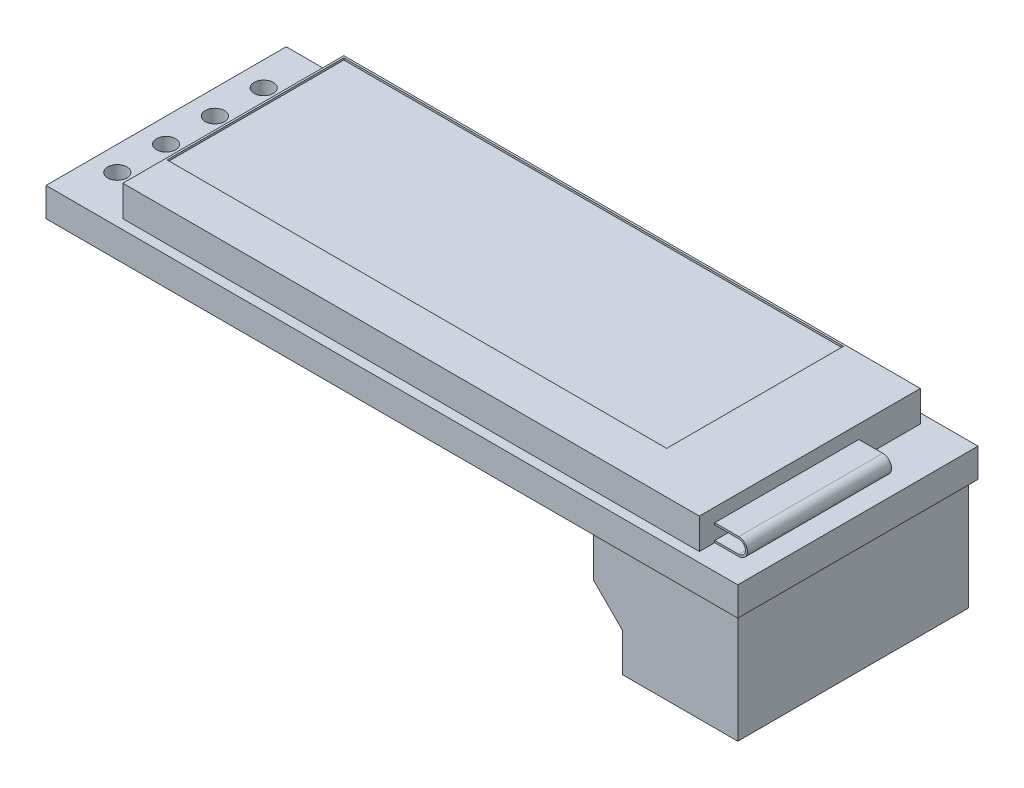
ISO-10303-21;
HEADER;
FILE_DESCRIPTION(('STEP AP214'),'2;1');
FILE_NAME('part.step','',(''),(''),'','','');
FILE_SCHEMA(('AUTOMOTIVE_DESIGN { 1 0 10303 214 1 1 1 1 }'));
ENDSEC;
DATA;
#1=APPLICATION_CONTEXT('core data for automotive mechanical design processes');
#2=APPLICATION_PROTOCOL_DEFINITION('international standard','automotive_design',2000,#1);
#3=PRODUCT_CONTEXT('',#1,'mechanical');
#4=PRODUCT('Part','Part','',(#3));
#5=PRODUCT_RELATED_PRODUCT_CATEGORY('part','',(#4));
#6=PRODUCT_DEFINITION_FORMATION('','',#4);
#7=PRODUCT_DEFINITION_CONTEXT('part definition',#1,'design');
#8=PRODUCT_DEFINITION('design','',#6,#7);
#9=PRODUCT_DEFINITION_SHAPE('','',#8);
#10=(LENGTH_UNIT() NAMED_UNIT(*) SI_UNIT(.MILLI.,.METRE.));
#11=(NAMED_UNIT(*) PLANE_ANGLE_UNIT() SI_UNIT($,.RADIAN.));
#12=(NAMED_UNIT(*) SI_UNIT($,.STERADIAN.) SOLID_ANGLE_UNIT());
#13=UNCERTAINTY_MEASURE_WITH_UNIT(LENGTH_MEASURE(1.E-05),#10,'distance_accuracy_value','');
#14=(GEOMETRIC_REPRESENTATION_CONTEXT(3) GLOBAL_UNCERTAINTY_ASSIGNED_CONTEXT((#13)) GLOBAL_UNIT_ASSIGNED_CONTEXT((#10,
#11,#12)) REPRESENTATION_CONTEXT('',''));
#15=CARTESIAN_POINT('',(0.,0.,0.));
#16=DIRECTION('',(0.,0.,1.));
#17=DIRECTION('',(1.,0.,0.));
#18=AXIS2_PLACEMENT_3D('',#15,#16,#17);
#19=CARTESIAN_POINT('',(0.,1.5,0.));
#20=DIRECTION('',(0.,-1.,0.));
#21=DIRECTION('',(0.,0.,-1.));
#22=AXIS2_PLACEMENT_3D('',#19,#20,#21);
#23=PLANE('',#22);
#24=CARTESIAN_POINT('',(-16.73,1.5,1.27));
#25=DIRECTION('',(0.,1.,0.));
#26=DIRECTION('',(0.,0.,1.));
#27=AXIS2_PLACEMENT_3D('',#24,#25,#26);
#28=CIRCLE('',#27,0.499999999999999);
#29=CARTESIAN_POINT('',(-16.73,1.5,1.77));
#30=VERTEX_POINT('',#29);
#31=EDGE_CURVE('E374',#30,#30,#28,.T.);
#32=ORIENTED_EDGE('',*,*,#31,.F.);
#33=EDGE_LOOP('',(#32));
#34=FACE_BOUND('',#33,.T.);
#35=CARTESIAN_POINT('',(-16.73,1.5,3.81));
#36=DIRECTION('',(0.,1.,0.));
#37=DIRECTION('',(0.,0.,1.));
#38=AXIS2_PLACEMENT_3D('',#35,#36,#37);
#39=CIRCLE('',#38,0.499999999999999);
#40=CARTESIAN_POINT('',(-16.73,1.5,4.31));
#41=VERTEX_POINT('',#40);
#42=EDGE_CURVE('E377',#41,#41,#39,.T.);
#43=ORIENTED_EDGE('',*,*,#42,.F.);
#44=EDGE_LOOP('',(#43));
#45=FACE_BOUND('',#44,.T.);
#46=DIRECTION('',(0.,0.,1.));
#47=VECTOR('',#46,1.);
#48=CARTESIAN_POINT('',(-18.,1.5,-6.25));
#49=LINE('',#48,#47);
#50=CARTESIAN_POINT('',(-18.,1.5,-6.25));
#51=VERTEX_POINT('',#50);
#52=CARTESIAN_POINT('',(-18.,1.5,6.25));
#53=VERTEX_POINT('',#52);
#54=EDGE_CURVE('E384',#51,#53,#49,.T.);
#55=ORIENTED_EDGE('',*,*,#54,.T.);
#56=DIRECTION('',(1.,0.,0.));
#57=VECTOR('',#56,1.);
#58=CARTESIAN_POINT('',(18.,1.5,6.25));
#59=LINE('',#58,#57);
#60=CARTESIAN_POINT('',(18.,1.5,6.25));
#61=VERTEX_POINT('',#60);
#62=EDGE_CURVE('E387',#53,#61,#59,.T.);
#63=ORIENTED_EDGE('',*,*,#62,.T.);
#64=DIRECTION('',(0.,0.,-1.));
#65=VECTOR('',#64,1.);
#66=CARTESIAN_POINT('',(18.,1.5,-6.25));
#67=LINE('',#66,#65);
#68=CARTESIAN_POINT('',(18.,1.5,-6.25));
#69=VERTEX_POINT('',#68);
#70=EDGE_CURVE('E390',#61,#69,#67,.T.);
#71=ORIENTED_EDGE('',*,*,#70,.T.);
#72=DIRECTION('',(-1.,0.,0.));
#73=VECTOR('',#72,1.);
#74=CARTESIAN_POINT('',(18.,1.5,-6.25));
#75=LINE('',#74,#73);
#76=EDGE_CURVE('E392',#69,#51,#75,.T.);
#77=ORIENTED_EDGE('',*,*,#76,.T.);
#78=EDGE_LOOP('',(#55,#63,#71,#77));
#79=FACE_BOUND('',#78,.T.);
#80=CARTESIAN_POINT('',(-16.73,1.5,-1.27));
#81=DIRECTION('',(0.,1.,0.));
#82=DIRECTION('',(0.,0.,1.));
#83=AXIS2_PLACEMENT_3D('',#80,#81,#82);
#84=CIRCLE('',#83,0.499999999999999);
#85=CARTESIAN_POINT('',(-16.73,1.5,-0.769999999999997));
#86=VERTEX_POINT('',#85);
#87=EDGE_CURVE('E416',#86,#86,#84,.T.);
#88=ORIENTED_EDGE('',*,*,#87,.F.);
#89=EDGE_LOOP('',(#88));
#90=FACE_BOUND('',#89,.T.);
#91=CARTESIAN_POINT('',(-16.73,1.5,-3.81));
#92=DIRECTION('',(0.,1.,0.));
#93=DIRECTION('',(0.,0.,1.));
#94=AXIS2_PLACEMENT_3D('',#91,#92,#93);
#95=CIRCLE('',#94,0.499999999999999);
#96=CARTESIAN_POINT('',(-16.73,1.5,-3.31));
#97=VERTEX_POINT('',#96);
#98=EDGE_CURVE('E422',#97,#97,#95,.T.);
#99=ORIENTED_EDGE('',*,*,#98,.F.);
#100=EDGE_LOOP('',(#99));
#101=FACE_BOUND('',#100,.T.);
#102=DIRECTION('',(1.,0.,0.));
#103=VECTOR('',#102,1.);
#104=CARTESIAN_POINT('',(15.5,1.5,-2.55));
#105=LINE('',#104,#103);
#106=CARTESIAN_POINT('',(15.5,1.5,-2.55));
#107=VERTEX_POINT('',#106);
#108=CARTESIAN_POINT('',(16.75,1.5,-2.55));
#109=VERTEX_POINT('',#108);
#110=EDGE_CURVE('E260',#107,#109,#105,.T.);
#111=ORIENTED_EDGE('',*,*,#110,.T.);
#112=DIRECTION('',(0.,0.,1.));
#113=VECTOR('',#112,1.);
#114=CARTESIAN_POINT('',(16.75,1.5,-2.55));
#115=LINE('',#114,#113);
#116=CARTESIAN_POINT('',(16.75,1.5,4.95));
#117=VERTEX_POINT('',#116);
#118=EDGE_CURVE('E286',#109,#117,#115,.T.);
#119=ORIENTED_EDGE('',*,*,#118,.T.);
#120=DIRECTION('',(1.,0.,0.));
#121=VECTOR('',#120,1.);
#122=CARTESIAN_POINT('',(15.5,1.5,4.95));
#123=LINE('',#122,#121);
#124=CARTESIAN_POINT('',(15.5,1.5,4.95));
#125=VERTEX_POINT('',#124);
#126=EDGE_CURVE('E279',#125,#117,#123,.T.);
#127=ORIENTED_EDGE('',*,*,#126,.F.);
#128=DIRECTION('',(0.,0.,-1.));
#129=VECTOR('',#128,1.);
#130=CARTESIAN_POINT('',(15.5,1.5,-5.75));
#131=LINE('',#130,#129);
#132=CARTESIAN_POINT('',(15.5,1.5,5.75));
#133=VERTEX_POINT('',#132);
#134=EDGE_CURVE('E319',#133,#125,#131,.T.);
#135=ORIENTED_EDGE('',*,*,#134,.F.);
#136=DIRECTION('',(1.,0.,0.));
#137=VECTOR('',#136,1.);
#138=CARTESIAN_POINT('',(15.5,1.5,5.75));
#139=LINE('',#138,#137);
#140=CARTESIAN_POINT('',(-14.5,1.5,5.75));
#141=VERTEX_POINT('',#140);
#142=EDGE_CURVE('E315',#141,#133,#139,.T.);
#143=ORIENTED_EDGE('',*,*,#142,.F.);
#144=DIRECTION('',(0.,0.,1.));
#145=VECTOR('',#144,1.);
#146=CARTESIAN_POINT('',(-14.5,1.5,-5.75));
#147=LINE('',#146,#145);
#148=CARTESIAN_POINT('',(-14.5,1.5,-5.75));
#149=VERTEX_POINT('',#148);
#150=EDGE_CURVE('E285',#149,#141,#147,.T.);
#151=ORIENTED_EDGE('',*,*,#150,.F.);
#152=DIRECTION('',(-1.,0.,0.));
#153=VECTOR('',#152,1.);
#154=CARTESIAN_POINT('',(15.5,1.5,-5.75));
#155=LINE('',#154,#153);
#156=CARTESIAN_POINT('',(15.5,1.5,-5.75));
#157=VERTEX_POINT('',#156);
#158=EDGE_CURVE('E306',#157,#149,#155,.T.);
#159=ORIENTED_EDGE('',*,*,#158,.F.);
#160=EDGE_CURVE('E318',#107,#157,#131,.T.);
#161=ORIENTED_EDGE('',*,*,#160,.F.);
#162=EDGE_LOOP('',(#111,#119,#127,#135,#143,#151,#159,#161));
#163=FACE_BOUND('',#162,.T.);
#164=ADVANCED_FACE('F35',(#34,#45,#79,#90,#101,#163),#23,.F.);
#165=CARTESIAN_POINT('',(15.5,3.1,-5.75));
#166=DIRECTION('',(-1.,0.,0.));
#167=DIRECTION('',(0.,0.,1.));
#168=AXIS2_PLACEMENT_3D('',#165,#166,#167);
#169=PLANE('',#168);
#170=DIRECTION('',(0.,1.,0.));
#171=VECTOR('',#170,1.);
#172=CARTESIAN_POINT('',(15.5,2.3,-2.55));
#173=LINE('',#172,#171);
#174=CARTESIAN_POINT('',(15.5,2.3,-2.55));
#175=VERTEX_POINT('',#174);
#176=CARTESIAN_POINT('',(15.5,2.4,-2.55));
#177=VERTEX_POINT('',#176);
#178=EDGE_CURVE('E249',#175,#177,#173,.T.);
#179=ORIENTED_EDGE('',*,*,#178,.F.);
#180=DIRECTION('',(0.,0.,1.));
#181=VECTOR('',#180,1.);
#182=CARTESIAN_POINT('',(15.5,2.3,-2.55));
#183=LINE('',#182,#181);
#184=CARTESIAN_POINT('',(15.5,2.3,4.95));
#185=VERTEX_POINT('',#184);
#186=EDGE_CURVE('E297',#175,#185,#183,.T.);
#187=ORIENTED_EDGE('',*,*,#186,.T.);
#188=DIRECTION('',(0.,1.,0.));
#189=VECTOR('',#188,1.);
#190=CARTESIAN_POINT('',(15.5,2.3,4.95));
#191=LINE('',#190,#189);
#192=CARTESIAN_POINT('',(15.5,2.4,4.95));
#193=VERTEX_POINT('',#192);
#194=EDGE_CURVE('E268',#185,#193,#191,.T.);
#195=ORIENTED_EDGE('',*,*,#194,.T.);
#196=DIRECTION('',(0.,0.,1.));
#197=VECTOR('',#196,1.);
#198=CARTESIAN_POINT('',(15.5,2.4,-2.55));
#199=LINE('',#198,#197);
#200=EDGE_CURVE('E266',#177,#193,#199,.T.);
#201=ORIENTED_EDGE('',*,*,#200,.F.);
#202=EDGE_LOOP('',(#179,#187,#195,#201));
#203=FACE_BOUND('',#202,.T.);
#204=DIRECTION('',(0.,1.,0.));
#205=VECTOR('',#204,1.);
#206=CARTESIAN_POINT('',(15.5,1.5,-2.55));
#207=LINE('',#206,#205);
#208=CARTESIAN_POINT('',(15.5,1.6,-2.55));
#209=VERTEX_POINT('',#208);
#210=EDGE_CURVE('E258',#107,#209,#207,.T.);
#211=ORIENTED_EDGE('',*,*,#210,.F.);
#212=ORIENTED_EDGE('',*,*,#160,.T.);
#213=DIRECTION('',(0.,-1.,0.));
#214=VECTOR('',#213,1.);
#215=CARTESIAN_POINT('',(15.5,3.1,-5.75));
#216=LINE('',#215,#214);
#217=CARTESIAN_POINT('',(15.5,3.1,-5.75));
#218=VERTEX_POINT('',#217);
#219=EDGE_CURVE('E326',#218,#157,#216,.T.);
#220=ORIENTED_EDGE('',*,*,#219,.F.);
#221=DIRECTION('',(0.,0.,-1.));
#222=VECTOR('',#221,1.);
#223=CARTESIAN_POINT('',(15.5,3.1,-5.75));
#224=LINE('',#223,#222);
#225=CARTESIAN_POINT('',(15.5,3.1,5.75));
#226=VERTEX_POINT('',#225);
#227=EDGE_CURVE('E308',#226,#218,#224,.T.);
#228=ORIENTED_EDGE('',*,*,#227,.F.);
#229=DIRECTION('',(0.,-1.,0.));
#230=VECTOR('',#229,1.);
#231=CARTESIAN_POINT('',(15.5,3.1,5.75));
#232=LINE('',#231,#230);
#233=EDGE_CURVE('E329',#226,#133,#232,.T.);
#234=ORIENTED_EDGE('',*,*,#233,.T.);
#235=ORIENTED_EDGE('',*,*,#134,.T.);
#236=DIRECTION('',(0.,1.,0.));
#237=VECTOR('',#236,1.);
#238=CARTESIAN_POINT('',(15.5,1.5,4.95));
#239=LINE('',#238,#237);
#240=CARTESIAN_POINT('',(15.5,1.6,4.95));
#241=VERTEX_POINT('',#240);
#242=EDGE_CURVE('E276',#125,#241,#239,.T.);
#243=ORIENTED_EDGE('',*,*,#242,.T.);
#244=DIRECTION('',(0.,0.,1.));
#245=VECTOR('',#244,1.);
#246=CARTESIAN_POINT('',(15.5,1.6,-2.55));
#247=LINE('',#246,#245);
#248=EDGE_CURVE('E289',#209,#241,#247,.T.);
#249=ORIENTED_EDGE('',*,*,#248,.F.);
#250=EDGE_LOOP('',(#211,#212,#220,#228,#234,#235,#243,#249));
#251=FACE_BOUND('',#250,.T.);
#252=ADVANCED_FACE('F468',(#203,#251),#169,.F.);
#253=CARTESIAN_POINT('',(0.,0.,0.));
#254=DIRECTION('',(0.,-1.,0.));
#255=DIRECTION('',(0.,0.,-1.));
#256=AXIS2_PLACEMENT_3D('',#253,#254,#255);
#257=PLANE('',#256);
#258=CARTESIAN_POINT('',(-16.73,0.,1.27));
#259=DIRECTION('',(0.,1.,0.));
#260=DIRECTION('',(0.,0.,1.));
#261=AXIS2_PLACEMENT_3D('',#258,#259,#260);
#262=CIRCLE('',#261,0.499999999999999);
#263=CARTESIAN_POINT('',(-16.73,0.,1.77));
#264=VERTEX_POINT('',#263);
#265=EDGE_CURVE('E371',#264,#264,#262,.T.);
#266=ORIENTED_EDGE('',*,*,#265,.T.);
#267=EDGE_LOOP('',(#266));
#268=FACE_BOUND('',#267,.T.);
#269=CARTESIAN_POINT('',(-16.73,0.,3.81));
#270=DIRECTION('',(0.,1.,0.));
#271=DIRECTION('',(0.,0.,1.));
#272=AXIS2_PLACEMENT_3D('',#269,#270,#271);
#273=CIRCLE('',#272,0.499999999999999);
#274=CARTESIAN_POINT('',(-16.73,0.,4.31));
#275=VERTEX_POINT('',#274);
#276=EDGE_CURVE('E378',#275,#275,#273,.T.);
#277=ORIENTED_EDGE('',*,*,#276,.T.);
#278=EDGE_LOOP('',(#277));
#279=FACE_BOUND('',#278,.T.);
#280=DIRECTION('',(0.,0.,1.));
#281=VECTOR('',#280,1.);
#282=CARTESIAN_POINT('',(-18.,0.,-6.25));
#283=LINE('',#282,#281);
#284=CARTESIAN_POINT('',(-18.,0.,-6.25));
#285=VERTEX_POINT('',#284);
#286=CARTESIAN_POINT('',(-18.,0.,6.25));
#287=VERTEX_POINT('',#286);
#288=EDGE_CURVE('E381',#285,#287,#283,.T.);
#289=ORIENTED_EDGE('',*,*,#288,.F.);
#290=DIRECTION('',(-1.,0.,0.));
#291=VECTOR('',#290,1.);
#292=CARTESIAN_POINT('',(18.,0.,-6.25));
#293=LINE('',#292,#291);
#294=CARTESIAN_POINT('',(18.,0.,-6.25));
#295=VERTEX_POINT('',#294);
#296=EDGE_CURVE('E388',#295,#285,#293,.T.);
#297=ORIENTED_EDGE('',*,*,#296,.F.);
#298=DIRECTION('',(0.,0.,-1.));
#299=VECTOR('',#298,1.);
#300=CARTESIAN_POINT('',(18.,0.,-6.25));
#301=LINE('',#300,#299);
#302=CARTESIAN_POINT('',(18.,0.,6.25));
#303=VERTEX_POINT('',#302);
#304=EDGE_CURVE('E399',#303,#295,#301,.T.);
#305=ORIENTED_EDGE('',*,*,#304,.F.);
#306=DIRECTION('',(1.,0.,0.));
#307=VECTOR('',#306,1.);
#308=CARTESIAN_POINT('',(18.,0.,6.25));
#309=LINE('',#308,#307);
#310=EDGE_CURVE('E397',#287,#303,#309,.T.);
#311=ORIENTED_EDGE('',*,*,#310,.F.);
#312=EDGE_LOOP('',(#289,#297,#305,#311));
#313=FACE_BOUND('',#312,.T.);
#314=CARTESIAN_POINT('',(-16.73,0.,-1.27));
#315=DIRECTION('',(0.,1.,0.));
#316=DIRECTION('',(0.,0.,1.));
#317=AXIS2_PLACEMENT_3D('',#314,#315,#316);
#318=CIRCLE('',#317,0.499999999999999);
#319=CARTESIAN_POINT('',(-16.73,0.,-0.769999999999997));
#320=VERTEX_POINT('',#319);
#321=EDGE_CURVE('E413',#320,#320,#318,.T.);
#322=ORIENTED_EDGE('',*,*,#321,.T.);
#323=EDGE_LOOP('',(#322));
#324=FACE_BOUND('',#323,.T.);
#325=CARTESIAN_POINT('',(-16.73,0.,-3.81));
#326=DIRECTION('',(0.,1.,0.));
#327=DIRECTION('',(0.,0.,1.));
#328=AXIS2_PLACEMENT_3D('',#325,#326,#327);
#329=CIRCLE('',#328,0.499999999999999);
#330=CARTESIAN_POINT('',(-16.73,0.,-3.31));
#331=VERTEX_POINT('',#330);
#332=EDGE_CURVE('E419',#331,#331,#329,.T.);
#333=ORIENTED_EDGE('',*,*,#332,.T.);
#334=EDGE_LOOP('',(#333));
#335=FACE_BOUND('',#334,.T.);
#336=DIRECTION('',(1.,0.,0.));
#337=VECTOR('',#336,1.);
#338=CARTESIAN_POINT('',(17.75,0.,-6.));
#339=LINE('',#338,#337);
#340=CARTESIAN_POINT('',(10.25,0.,-6.));
#341=VERTEX_POINT('',#340);
#342=CARTESIAN_POINT('',(17.75,0.,-6.));
#343=VERTEX_POINT('',#342);
#344=EDGE_CURVE('E356',#341,#343,#339,.T.);
#345=ORIENTED_EDGE('',*,*,#344,.F.);
#346=DIRECTION('',(0.,0.,-1.));
#347=VECTOR('',#346,1.);
#348=CARTESIAN_POINT('',(10.25,0.,-6.));
#349=LINE('',#348,#347);
#350=CARTESIAN_POINT('',(10.25,0.,6.));
#351=VERTEX_POINT('',#350);
#352=EDGE_CURVE('E344',#351,#341,#349,.T.);
#353=ORIENTED_EDGE('',*,*,#352,.F.);
#354=DIRECTION('',(-1.,0.,0.));
#355=VECTOR('',#354,1.);
#356=CARTESIAN_POINT('',(17.75,0.,6.));
#357=LINE('',#356,#355);
#358=CARTESIAN_POINT('',(17.75,0.,6.));
#359=VERTEX_POINT('',#358);
#360=EDGE_CURVE('E348',#359,#351,#357,.T.);
#361=ORIENTED_EDGE('',*,*,#360,.F.);
#362=DIRECTION('',(0.,0.,1.));
#363=VECTOR('',#362,1.);
#364=CARTESIAN_POINT('',(17.75,0.,-6.));
#365=LINE('',#364,#363);
#366=EDGE_CURVE('E358',#343,#359,#365,.T.);
#367=ORIENTED_EDGE('',*,*,#366,.F.);
#368=EDGE_LOOP('',(#345,#353,#361,#367));
#369=FACE_BOUND('',#368,.T.);
#370=ADVANCED_FACE('F451',(#268,#279,#313,#324,#335,#369),#257,.T.);
#371=CARTESIAN_POINT('',(-16.73,0.,-3.81));
#372=DIRECTION('',(0.,1.,0.));
#373=DIRECTION('',(0.,0.,1.));
#374=AXIS2_PLACEMENT_3D('',#371,#372,#373);
#375=CYLINDRICAL_SURFACE('',#374,0.499999999999999);
#376=ORIENTED_EDGE('',*,*,#332,.F.);
#377=EDGE_LOOP('',(#376));
#378=FACE_BOUND('',#377,.T.);
#379=ORIENTED_EDGE('',*,*,#98,.T.);
#380=EDGE_LOOP('',(#379));
#381=FACE_BOUND('',#380,.T.);
#382=ADVANCED_FACE('F484',(#378,#381),#375,.F.);
#383=CARTESIAN_POINT('',(-16.73,0.,-1.27));
#384=DIRECTION('',(0.,1.,0.));
#385=DIRECTION('',(0.,0.,1.));
#386=AXIS2_PLACEMENT_3D('',#383,#384,#385);
#387=CYLINDRICAL_SURFACE('',#386,0.499999999999999);
#388=ORIENTED_EDGE('',*,*,#321,.F.);
#389=EDGE_LOOP('',(#388));
#390=FACE_BOUND('',#389,.T.);
#391=ORIENTED_EDGE('',*,*,#87,.T.);
#392=EDGE_LOOP('',(#391));
#393=FACE_BOUND('',#392,.T.);
#394=ADVANCED_FACE('F501',(#390,#393),#387,.F.);
#395=CARTESIAN_POINT('',(-18.,1.5,-6.25));
#396=DIRECTION('',(1.,0.,0.));
#397=DIRECTION('',(0.,0.,-1.));
#398=AXIS2_PLACEMENT_3D('',#395,#396,#397);
#399=PLANE('',#398);
#400=ORIENTED_EDGE('',*,*,#288,.T.);
#401=DIRECTION('',(0.,-1.,0.));
#402=VECTOR('',#401,1.);
#403=CARTESIAN_POINT('',(-18.,1.5,6.25));
#404=LINE('',#403,#402);
#405=EDGE_CURVE('E410',#53,#287,#404,.T.);
#406=ORIENTED_EDGE('',*,*,#405,.F.);
#407=ORIENTED_EDGE('',*,*,#54,.F.);
#408=DIRECTION('',(0.,-1.,0.));
#409=VECTOR('',#408,1.);
#410=CARTESIAN_POINT('',(-18.,1.5,-6.25));
#411=LINE('',#410,#409);
#412=EDGE_CURVE('E394',#51,#285,#411,.T.);
#413=ORIENTED_EDGE('',*,*,#412,.T.);
#414=EDGE_LOOP('',(#400,#406,#407,#413));
#415=FACE_BOUND('',#414,.T.);
#416=ADVANCED_FACE('F497',(#415),#399,.F.);
#417=CARTESIAN_POINT('',(18.,1.5,6.25));
#418=DIRECTION('',(0.,0.,-1.));
#419=DIRECTION('',(-1.,0.,0.));
#420=AXIS2_PLACEMENT_3D('',#417,#418,#419);
#421=PLANE('',#420);
#422=ORIENTED_EDGE('',*,*,#310,.T.);
#423=DIRECTION('',(0.,-1.,0.));
#424=VECTOR('',#423,1.);
#425=CARTESIAN_POINT('',(18.,1.5,6.25));
#426=LINE('',#425,#424);
#427=EDGE_CURVE('E407',#61,#303,#426,.T.);
#428=ORIENTED_EDGE('',*,*,#427,.F.);
#429=ORIENTED_EDGE('',*,*,#62,.F.);
#430=ORIENTED_EDGE('',*,*,#405,.T.);
#431=EDGE_LOOP('',(#422,#428,#429,#430));
#432=FACE_BOUND('',#431,.T.);
#433=ADVANCED_FACE('F493',(#432),#421,.F.);
#434=CARTESIAN_POINT('',(18.,1.5,-6.25));
#435=DIRECTION('',(-1.,0.,0.));
#436=DIRECTION('',(0.,0.,1.));
#437=AXIS2_PLACEMENT_3D('',#434,#435,#436);
#438=PLANE('',#437);
#439=ORIENTED_EDGE('',*,*,#304,.T.);
#440=DIRECTION('',(0.,-1.,0.));
#441=VECTOR('',#440,1.);
#442=CARTESIAN_POINT('',(18.,1.5,-6.25));
#443=LINE('',#442,#441);
#444=EDGE_CURVE('E404',#69,#295,#443,.T.);
#445=ORIENTED_EDGE('',*,*,#444,.F.);
#446=ORIENTED_EDGE('',*,*,#70,.F.);
#447=ORIENTED_EDGE('',*,*,#427,.T.);
#448=EDGE_LOOP('',(#439,#445,#446,#447));
#449=FACE_BOUND('',#448,.T.);
#450=ADVANCED_FACE('F489',(#449),#438,.F.);
#451=CARTESIAN_POINT('',(18.,1.5,-6.25));
#452=DIRECTION('',(0.,0.,1.));
#453=DIRECTION('',(1.,0.,0.));
#454=AXIS2_PLACEMENT_3D('',#451,#452,#453);
#455=PLANE('',#454);
#456=ORIENTED_EDGE('',*,*,#296,.T.);
#457=ORIENTED_EDGE('',*,*,#412,.F.);
#458=ORIENTED_EDGE('',*,*,#76,.F.);
#459=ORIENTED_EDGE('',*,*,#444,.T.);
#460=EDGE_LOOP('',(#456,#457,#458,#459));
#461=FACE_BOUND('',#460,.T.);
#462=ADVANCED_FACE('F486',(#461),#455,.F.);
#463=CARTESIAN_POINT('',(-16.73,0.,3.81));
#464=DIRECTION('',(0.,1.,0.));
#465=DIRECTION('',(0.,0.,1.));
#466=AXIS2_PLACEMENT_3D('',#463,#464,#465);
#467=CYLINDRICAL_SURFACE('',#466,0.499999999999999);
#468=ORIENTED_EDGE('',*,*,#276,.F.);
#469=EDGE_LOOP('',(#468));
#470=FACE_BOUND('',#469,.T.);
#471=ORIENTED_EDGE('',*,*,#42,.T.);
#472=EDGE_LOOP('',(#471));
#473=FACE_BOUND('',#472,.T.);
#474=ADVANCED_FACE('F480',(#470,#473),#467,.F.);
#475=CARTESIAN_POINT('',(-16.73,0.,1.27));
#476=DIRECTION('',(0.,1.,0.));
#477=DIRECTION('',(0.,0.,1.));
#478=AXIS2_PLACEMENT_3D('',#475,#476,#477);
#479=CYLINDRICAL_SURFACE('',#478,0.499999999999999);
#480=ORIENTED_EDGE('',*,*,#265,.F.);
#481=EDGE_LOOP('',(#480));
#482=FACE_BOUND('',#481,.T.);
#483=ORIENTED_EDGE('',*,*,#31,.T.);
#484=EDGE_LOOP('',(#483));
#485=FACE_BOUND('',#484,.T.);
#486=ADVANCED_FACE('F610',(#482,#485),#479,.F.);
#487=CARTESIAN_POINT('',(10.25,-5.8,-6.));
#488=DIRECTION('',(1.,0.,0.));
#489=DIRECTION('',(0.,0.,-1.));
#490=AXIS2_PLACEMENT_3D('',#487,#488,#489);
#491=PLANE('',#490);
#492=DIRECTION('',(0.,1.,0.));
#493=VECTOR('',#492,1.);
#494=CARTESIAN_POINT('',(10.25,-5.8,-6.));
#495=LINE('',#494,#493);
#496=CARTESIAN_POINT('',(10.25,-2.3,-6.));
#497=VERTEX_POINT('',#496);
#498=EDGE_CURVE('E369',#497,#341,#495,.T.);
#499=ORIENTED_EDGE('',*,*,#498,.F.);
#500=DIRECTION('',(0.,0.,1.));
#501=VECTOR('',#500,1.);
#502=CARTESIAN_POINT('',(10.25,-2.3,-6.));
#503=LINE('',#502,#501);
#504=CARTESIAN_POINT('',(10.25,-2.3,6.));
#505=VERTEX_POINT('',#504);
#506=EDGE_CURVE('E427',#497,#505,#503,.T.);
#507=ORIENTED_EDGE('',*,*,#506,.T.);
#508=DIRECTION('',(0.,1.,0.));
#509=VECTOR('',#508,1.);
#510=CARTESIAN_POINT('',(10.25,-5.8,6.));
#511=LINE('',#510,#509);
#512=EDGE_CURVE('E353',#505,#351,#511,.T.);
#513=ORIENTED_EDGE('',*,*,#512,.T.);
#514=ORIENTED_EDGE('',*,*,#352,.T.);
#515=EDGE_LOOP('',(#499,#507,#513,#514));
#516=FACE_BOUND('',#515,.T.);
#517=ADVANCED_FACE('F445',(#516),#491,.F.);
#518=CARTESIAN_POINT('',(17.75,-5.8,-6.));
#519=DIRECTION('',(0.,0.,1.));
#520=DIRECTION('',(1.,0.,0.));
#521=AXIS2_PLACEMENT_3D('',#518,#519,#520);
#522=PLANE('',#521);
#523=DIRECTION('',(0.,1.,0.));
#524=VECTOR('',#523,1.);
#525=CARTESIAN_POINT('',(11.75,-5.8,-6.));
#526=LINE('',#525,#524);
#527=CARTESIAN_POINT('',(11.75,-5.8,-6.));
#528=VERTEX_POINT('',#527);
#529=CARTESIAN_POINT('',(11.75,-3.8,-6.));
#530=VERTEX_POINT('',#529);
#531=EDGE_CURVE('E341',#528,#530,#526,.T.);
#532=ORIENTED_EDGE('',*,*,#531,.T.);
#533=DIRECTION('',(0.707106781186549,-0.707106781186547,0.));
#534=VECTOR('',#533,1.);
#535=CARTESIAN_POINT('',(10.25,-2.3,-6.));
#536=LINE('',#535,#534);
#537=EDGE_CURVE('E11',#530,#497,#536,.F.);
#538=ORIENTED_EDGE('',*,*,#537,.T.);
#539=ORIENTED_EDGE('',*,*,#498,.T.);
#540=ORIENTED_EDGE('',*,*,#344,.T.);
#541=DIRECTION('',(0.,1.,0.));
#542=VECTOR('',#541,1.);
#543=CARTESIAN_POINT('',(17.75,-5.8,-6.));
#544=LINE('',#543,#542);
#545=CARTESIAN_POINT('',(17.75,-5.8,-6.));
#546=VERTEX_POINT('',#545);
#547=EDGE_CURVE('E366',#546,#343,#544,.T.);
#548=ORIENTED_EDGE('',*,*,#547,.F.);
#549=DIRECTION('',(1.,0.,0.));
#550=VECTOR('',#549,1.);
#551=CARTESIAN_POINT('',(17.75,-5.8,-6.));
#552=LINE('',#551,#550);
#553=EDGE_CURVE('E345',#528,#546,#552,.T.);
#554=ORIENTED_EDGE('',*,*,#553,.F.);
#555=EDGE_LOOP('',(#532,#538,#539,#540,#548,#554));
#556=FACE_BOUND('',#555,.T.);
#557=ADVANCED_FACE('F442',(#556),#522,.F.);
#558=CARTESIAN_POINT('',(17.75,-5.8,-6.));
#559=DIRECTION('',(-1.,0.,0.));
#560=DIRECTION('',(0.,0.,1.));
#561=AXIS2_PLACEMENT_3D('',#558,#559,#560);
#562=PLANE('',#561);
#563=ORIENTED_EDGE('',*,*,#366,.T.);
#564=DIRECTION('',(0.,1.,0.));
#565=VECTOR('',#564,1.);
#566=CARTESIAN_POINT('',(17.75,-5.8,6.));
#567=LINE('',#566,#565);
#568=CARTESIAN_POINT('',(17.75,-5.8,6.));
#569=VERTEX_POINT('',#568);
#570=EDGE_CURVE('E364',#569,#359,#567,.T.);
#571=ORIENTED_EDGE('',*,*,#570,.F.);
#572=DIRECTION('',(0.,0.,1.));
#573=VECTOR('',#572,1.);
#574=CARTESIAN_POINT('',(17.75,-5.8,-6.));
#575=LINE('',#574,#573);
#576=EDGE_CURVE('E347',#546,#569,#575,.T.);
#577=ORIENTED_EDGE('',*,*,#576,.F.);
#578=ORIENTED_EDGE('',*,*,#547,.T.);
#579=EDGE_LOOP('',(#563,#571,#577,#578));
#580=FACE_BOUND('',#579,.T.);
#581=ADVANCED_FACE('F455',(#580),#562,.F.);
#582=CARTESIAN_POINT('',(17.75,-5.8,6.));
#583=DIRECTION('',(0.,0.,-1.));
#584=DIRECTION('',(-1.,0.,0.));
#585=AXIS2_PLACEMENT_3D('',#582,#583,#584);
#586=PLANE('',#585);
#587=ORIENTED_EDGE('',*,*,#512,.F.);
#588=DIRECTION('',(-0.707106781186549,0.707106781186547,0.));
#589=VECTOR('',#588,1.);
#590=CARTESIAN_POINT('',(10.25,-2.3,6.));
#591=LINE('',#590,#589);
#592=CARTESIAN_POINT('',(11.75,-3.8,6.));
#593=VERTEX_POINT('',#592);
#594=EDGE_CURVE('E43',#505,#593,#591,.F.);
#595=ORIENTED_EDGE('',*,*,#594,.T.);
#596=DIRECTION('',(0.,1.,0.));
#597=VECTOR('',#596,1.);
#598=CARTESIAN_POINT('',(11.75,-5.8,6.));
#599=LINE('',#598,#597);
#600=CARTESIAN_POINT('',(11.75,-5.8,6.));
#601=VERTEX_POINT('',#600);
#602=EDGE_CURVE('E335',#601,#593,#599,.T.);
#603=ORIENTED_EDGE('',*,*,#602,.F.);
#604=DIRECTION('',(-1.,0.,0.));
#605=VECTOR('',#604,1.);
#606=CARTESIAN_POINT('',(17.75,-5.8,6.));
#607=LINE('',#606,#605);
#608=EDGE_CURVE('E350',#569,#601,#607,.T.);
#609=ORIENTED_EDGE('',*,*,#608,.F.);
#610=ORIENTED_EDGE('',*,*,#570,.T.);
#611=ORIENTED_EDGE('',*,*,#360,.T.);
#612=EDGE_LOOP('',(#587,#595,#603,#609,#610,#611));
#613=FACE_BOUND('',#612,.T.);
#614=ADVANCED_FACE('F432',(#613),#586,.F.);
#615=CARTESIAN_POINT('',(0.,-5.8,0.));
#616=DIRECTION('',(0.,-1.,0.));
#617=DIRECTION('',(0.,0.,-1.));
#618=AXIS2_PLACEMENT_3D('',#615,#616,#617);
#619=PLANE('',#618);
#620=DIRECTION('',(0.,0.,1.));
#621=VECTOR('',#620,1.);
#622=CARTESIAN_POINT('',(11.75,-5.8,0.));
#623=LINE('',#622,#621);
#624=EDGE_CURVE('E425',#528,#601,#623,.T.);
#625=ORIENTED_EDGE('',*,*,#624,.F.);
#626=ORIENTED_EDGE('',*,*,#553,.T.);
#627=ORIENTED_EDGE('',*,*,#576,.T.);
#628=ORIENTED_EDGE('',*,*,#608,.T.);
#629=EDGE_LOOP('',(#625,#626,#627,#628));
#630=FACE_BOUND('',#629,.T.);
#631=ADVANCED_FACE('F458',(#630),#619,.T.);
#632=CARTESIAN_POINT('',(11.75,-5.8,-6.25));
#633=DIRECTION('',(1.,0.,0.));
#634=DIRECTION('',(0.,0.,-1.));
#635=AXIS2_PLACEMENT_3D('',#632,#633,#634);
#636=PLANE('',#635);
#637=ORIENTED_EDGE('',*,*,#624,.T.);
#638=ORIENTED_EDGE('',*,*,#602,.T.);
#639=DIRECTION('',(0.,0.,1.));
#640=VECTOR('',#639,1.);
#641=CARTESIAN_POINT('',(11.75,-3.8,-6.25));
#642=LINE('',#641,#640);
#643=EDGE_CURVE('E338',#530,#593,#642,.T.);
#644=ORIENTED_EDGE('',*,*,#643,.F.);
#645=ORIENTED_EDGE('',*,*,#531,.F.);
#646=EDGE_LOOP('',(#637,#638,#644,#645));
#647=FACE_BOUND('',#646,.T.);
#648=ADVANCED_FACE('F437',(#647),#636,.F.);
#649=CARTESIAN_POINT('',(10.25,-2.3,-6.));
#650=DIRECTION('',(0.707106781186547,0.707106781186549,0.));
#651=DIRECTION('',(0.,0.,1.));
#652=AXIS2_PLACEMENT_3D('',#649,#650,#651);
#653=PLANE('',#652);
#654=ORIENTED_EDGE('',*,*,#537,.F.);
#655=ORIENTED_EDGE('',*,*,#643,.T.);
#656=ORIENTED_EDGE('',*,*,#594,.F.);
#657=ORIENTED_EDGE('',*,*,#506,.F.);
#658=EDGE_LOOP('',(#654,#655,#656,#657));
#659=FACE_BOUND('',#658,.T.);
#660=ADVANCED_FACE('F37',(#659),#653,.F.);
#661=CARTESIAN_POINT('',(-14.5,3.1,-5.75));
#662=DIRECTION('',(1.,0.,0.));
#663=DIRECTION('',(0.,0.,-1.));
#664=AXIS2_PLACEMENT_3D('',#661,#662,#663);
#665=PLANE('',#664);
#666=ORIENTED_EDGE('',*,*,#150,.T.);
#667=DIRECTION('',(0.,-1.,0.));
#668=VECTOR('',#667,1.);
#669=CARTESIAN_POINT('',(-14.5,3.1,5.75));
#670=LINE('',#669,#668);
#671=CARTESIAN_POINT('',(-14.5,3.1,5.75));
#672=VERTEX_POINT('',#671);
#673=EDGE_CURVE('E332',#672,#141,#670,.T.);
#674=ORIENTED_EDGE('',*,*,#673,.F.);
#675=DIRECTION('',(0.,0.,1.));
#676=VECTOR('',#675,1.);
#677=CARTESIAN_POINT('',(-14.5,3.1,-5.75));
#678=LINE('',#677,#676);
#679=CARTESIAN_POINT('',(-14.5,3.1,-5.75));
#680=VERTEX_POINT('',#679);
#681=EDGE_CURVE('E302',#680,#672,#678,.T.);
#682=ORIENTED_EDGE('',*,*,#681,.F.);
#683=DIRECTION('',(0.,-1.,0.));
#684=VECTOR('',#683,1.);
#685=CARTESIAN_POINT('',(-14.5,3.1,-5.75));
#686=LINE('',#685,#684);
#687=EDGE_CURVE('E312',#680,#149,#686,.T.);
#688=ORIENTED_EDGE('',*,*,#687,.T.);
#689=EDGE_LOOP('',(#666,#674,#682,#688));
#690=FACE_BOUND('',#689,.T.);
#691=ADVANCED_FACE('F559',(#690),#665,.F.);
#692=CARTESIAN_POINT('',(15.5,3.1,5.75));
#693=DIRECTION('',(0.,0.,-1.));
#694=DIRECTION('',(-1.,0.,0.));
#695=AXIS2_PLACEMENT_3D('',#692,#693,#694);
#696=PLANE('',#695);
#697=ORIENTED_EDGE('',*,*,#142,.T.);
#698=ORIENTED_EDGE('',*,*,#233,.F.);
#699=DIRECTION('',(1.,0.,0.));
#700=VECTOR('',#699,1.);
#701=CARTESIAN_POINT('',(15.5,3.1,5.75));
#702=LINE('',#701,#700);
#703=EDGE_CURVE('E305',#672,#226,#702,.T.);
#704=ORIENTED_EDGE('',*,*,#703,.F.);
#705=ORIENTED_EDGE('',*,*,#673,.T.);
#706=EDGE_LOOP('',(#697,#698,#704,#705));
#707=FACE_BOUND('',#706,.T.);
#708=ADVANCED_FACE('F551',(#707),#696,.F.);
#709=CARTESIAN_POINT('',(15.5,3.1,-5.75));
#710=DIRECTION('',(0.,0.,1.));
#711=DIRECTION('',(1.,0.,0.));
#712=AXIS2_PLACEMENT_3D('',#709,#710,#711);
#713=PLANE('',#712);
#714=ORIENTED_EDGE('',*,*,#158,.T.);
#715=ORIENTED_EDGE('',*,*,#687,.F.);
#716=DIRECTION('',(-1.,0.,0.));
#717=VECTOR('',#716,1.);
#718=CARTESIAN_POINT('',(15.5,3.1,-5.75));
#719=LINE('',#718,#717);
#720=EDGE_CURVE('E310',#218,#680,#719,.T.);
#721=ORIENTED_EDGE('',*,*,#720,.F.);
#722=ORIENTED_EDGE('',*,*,#219,.T.);
#723=EDGE_LOOP('',(#714,#715,#721,#722));
#724=FACE_BOUND('',#723,.T.);
#725=ADVANCED_FACE('F556',(#724),#713,.F.);
#726=CARTESIAN_POINT('',(0.,3.1,0.));
#727=DIRECTION('',(0.,-1.,0.));
#728=DIRECTION('',(0.,0.,-1.));
#729=AXIS2_PLACEMENT_3D('',#726,#727,#728);
#730=PLANE('',#729);
#731=DIRECTION('',(1.,0.,0.));
#732=VECTOR('',#731,1.);
#733=CARTESIAN_POINT('',(11.6,3.1,3.55));
#734=LINE('',#733,#732);
#735=CARTESIAN_POINT('',(-14.4,3.1,3.55));
#736=VERTEX_POINT('',#735);
#737=CARTESIAN_POINT('',(11.6,3.1,3.55));
#738=VERTEX_POINT('',#737);
#739=EDGE_CURVE('E236',#736,#738,#734,.T.);
#740=ORIENTED_EDGE('',*,*,#739,.F.);
#741=DIRECTION('',(0.,0.,1.));
#742=VECTOR('',#741,1.);
#743=CARTESIAN_POINT('',(-14.4,3.1,3.55));
#744=LINE('',#743,#742);
#745=CARTESIAN_POINT('',(-14.4,3.1,-5.65));
#746=VERTEX_POINT('',#745);
#747=EDGE_CURVE('E50',#746,#736,#744,.T.);
#748=ORIENTED_EDGE('',*,*,#747,.F.);
#749=DIRECTION('',(-1.,0.,0.));
#750=VECTOR('',#749,1.);
#751=CARTESIAN_POINT('',(11.6,3.1,-5.65));
#752=LINE('',#751,#750);
#753=CARTESIAN_POINT('',(11.6,3.1,-5.65));
#754=VERTEX_POINT('',#753);
#755=EDGE_CURVE('E227',#754,#746,#752,.T.);
#756=ORIENTED_EDGE('',*,*,#755,.F.);
#757=DIRECTION('',(0.,0.,-1.));
#758=VECTOR('',#757,1.);
#759=CARTESIAN_POINT('',(11.6,3.1,3.55));
#760=LINE('',#759,#758);
#761=EDGE_CURVE('E230',#738,#754,#760,.T.);
#762=ORIENTED_EDGE('',*,*,#761,.F.);
#763=EDGE_LOOP('',(#740,#748,#756,#762));
#764=FACE_BOUND('',#763,.T.);
#765=ORIENTED_EDGE('',*,*,#681,.T.);
#766=ORIENTED_EDGE('',*,*,#703,.T.);
#767=ORIENTED_EDGE('',*,*,#227,.T.);
#768=ORIENTED_EDGE('',*,*,#720,.T.);
#769=EDGE_LOOP('',(#765,#766,#767,#768));
#770=FACE_BOUND('',#769,.T.);
#771=ADVANCED_FACE('F561',(#764,#770),#730,.F.);
#772=CARTESIAN_POINT('',(16.75,2.4,-2.55));
#773=DIRECTION('',(0.,1.,0.));
#774=DIRECTION('',(-1.,0.,0.));
#775=AXIS2_PLACEMENT_3D('',#772,#773,#774);
#776=PLANE('',#775);
#777=DIRECTION('',(-1.,0.,0.));
#778=VECTOR('',#777,1.);
#779=CARTESIAN_POINT('',(16.75,2.4,4.95));
#780=LINE('',#779,#778);
#781=CARTESIAN_POINT('',(16.75,2.4,4.95));
#782=VERTEX_POINT('',#781);
#783=EDGE_CURVE('E242',#782,#193,#780,.T.);
#784=ORIENTED_EDGE('',*,*,#783,.F.);
#785=DIRECTION('',(0.,0.,1.));
#786=VECTOR('',#785,1.);
#787=CARTESIAN_POINT('',(16.75,2.4,-2.55));
#788=LINE('',#787,#786);
#789=CARTESIAN_POINT('',(16.75,2.4,-2.55));
#790=VERTEX_POINT('',#789);
#791=EDGE_CURVE('E283',#790,#782,#788,.T.);
#792=ORIENTED_EDGE('',*,*,#791,.F.);
#793=DIRECTION('',(-1.,0.,0.));
#794=VECTOR('',#793,1.);
#795=CARTESIAN_POINT('',(16.75,2.4,-2.55));
#796=LINE('',#795,#794);
#797=EDGE_CURVE('E246',#790,#177,#796,.T.);
#798=ORIENTED_EDGE('',*,*,#797,.T.);
#799=ORIENTED_EDGE('',*,*,#200,.T.);
#800=EDGE_LOOP('',(#784,#792,#798,#799));
#801=FACE_BOUND('',#800,.T.);
#802=ADVANCED_FACE('F543',(#801),#776,.T.);
#803=CARTESIAN_POINT('',(16.75,1.95,-2.55));
#804=DIRECTION('',(0.,0.,1.));
#805=DIRECTION('',(1.,0.,0.));
#806=AXIS2_PLACEMENT_3D('',#803,#804,#805);
#807=CYLINDRICAL_SURFACE('',#806,0.45);
#808=CARTESIAN_POINT('',(16.75,1.95,4.95));
#809=DIRECTION('',(0.,0.,1.));
#810=DIRECTION('',(1.,0.,0.));
#811=AXIS2_PLACEMENT_3D('',#808,#809,#810);
#812=CIRCLE('',#811,0.45);
#813=EDGE_CURVE('E250',#117,#782,#812,.T.);
#814=ORIENTED_EDGE('',*,*,#813,.F.);
#815=ORIENTED_EDGE('',*,*,#118,.F.);
#816=CARTESIAN_POINT('',(16.75,1.95,-2.55));
#817=DIRECTION('',(0.,0.,1.));
#818=DIRECTION('',(1.,0.,0.));
#819=AXIS2_PLACEMENT_3D('',#816,#817,#818);
#820=CIRCLE('',#819,0.45);
#821=EDGE_CURVE('E263',#109,#790,#820,.T.);
#822=ORIENTED_EDGE('',*,*,#821,.T.);
#823=ORIENTED_EDGE('',*,*,#791,.T.);
#824=EDGE_LOOP('',(#814,#815,#822,#823));
#825=FACE_BOUND('',#824,.T.);
#826=ADVANCED_FACE('F546',(#825),#807,.T.);
#827=CARTESIAN_POINT('',(15.5,1.6,-2.55));
#828=DIRECTION('',(0.,-1.,0.));
#829=DIRECTION('',(0.,0.,-1.));
#830=AXIS2_PLACEMENT_3D('',#827,#828,#829);
#831=PLANE('',#830);
#832=DIRECTION('',(1.,0.,0.));
#833=VECTOR('',#832,1.);
#834=CARTESIAN_POINT('',(15.5,1.6,4.95));
#835=LINE('',#834,#833);
#836=CARTESIAN_POINT('',(16.75,1.6,4.95));
#837=VERTEX_POINT('',#836);
#838=EDGE_CURVE('E58',#241,#837,#835,.T.);
#839=ORIENTED_EDGE('',*,*,#838,.T.);
#840=DIRECTION('',(0.,0.,1.));
#841=VECTOR('',#840,1.);
#842=CARTESIAN_POINT('',(16.75,1.6,-2.55));
#843=LINE('',#842,#841);
#844=CARTESIAN_POINT('',(16.75,1.6,-2.55));
#845=VERTEX_POINT('',#844);
#846=EDGE_CURVE('E291',#845,#837,#843,.T.);
#847=ORIENTED_EDGE('',*,*,#846,.F.);
#848=DIRECTION('',(1.,0.,0.));
#849=VECTOR('',#848,1.);
#850=CARTESIAN_POINT('',(15.5,1.6,-2.55));
#851=LINE('',#850,#849);
#852=EDGE_CURVE('E256',#209,#845,#851,.T.);
#853=ORIENTED_EDGE('',*,*,#852,.F.);
#854=ORIENTED_EDGE('',*,*,#248,.T.);
#855=EDGE_LOOP('',(#839,#847,#853,#854));
#856=FACE_BOUND('',#855,.T.);
#857=ADVANCED_FACE('F527',(#856),#831,.F.);
#858=CARTESIAN_POINT('',(16.75,1.95,-2.55));
#859=DIRECTION('',(0.,0.,1.));
#860=DIRECTION('',(1.,0.,0.));
#861=AXIS2_PLACEMENT_3D('',#858,#859,#860);
#862=CYLINDRICAL_SURFACE('',#861,0.35);
#863=CARTESIAN_POINT('',(16.75,1.95,4.95));
#864=DIRECTION('',(0.,0.,1.));
#865=DIRECTION('',(1.,0.,0.));
#866=AXIS2_PLACEMENT_3D('',#863,#864,#865);
#867=CIRCLE('',#866,0.35);
#868=CARTESIAN_POINT('',(16.75,2.3,4.95));
#869=VERTEX_POINT('',#868);
#870=EDGE_CURVE('E273',#837,#869,#867,.T.);
#871=ORIENTED_EDGE('',*,*,#870,.T.);
#872=DIRECTION('',(0.,0.,1.));
#873=VECTOR('',#872,1.);
#874=CARTESIAN_POINT('',(16.75,2.3,-2.55));
#875=LINE('',#874,#873);
#876=CARTESIAN_POINT('',(16.75,2.3,-2.55));
#877=VERTEX_POINT('',#876);
#878=EDGE_CURVE('E294',#877,#869,#875,.T.);
#879=ORIENTED_EDGE('',*,*,#878,.F.);
#880=CARTESIAN_POINT('',(16.75,1.95,-2.55));
#881=DIRECTION('',(0.,0.,1.));
#882=DIRECTION('',(1.,0.,0.));
#883=AXIS2_PLACEMENT_3D('',#880,#881,#882);
#884=CIRCLE('',#883,0.35);
#885=EDGE_CURVE('E254',#845,#877,#884,.T.);
#886=ORIENTED_EDGE('',*,*,#885,.F.);
#887=ORIENTED_EDGE('',*,*,#846,.T.);
#888=EDGE_LOOP('',(#871,#879,#886,#887));
#889=FACE_BOUND('',#888,.T.);
#890=ADVANCED_FACE('F534',(#889),#862,.F.);
#891=CARTESIAN_POINT('',(16.75,2.3,-2.55));
#892=DIRECTION('',(0.,1.,0.));
#893=DIRECTION('',(-1.,0.,0.));
#894=AXIS2_PLACEMENT_3D('',#891,#892,#893);
#895=PLANE('',#894);
#896=DIRECTION('',(-1.,0.,0.));
#897=VECTOR('',#896,1.);
#898=CARTESIAN_POINT('',(16.75,2.3,4.95));
#899=LINE('',#898,#897);
#900=EDGE_CURVE('E271',#869,#185,#899,.T.);
#901=ORIENTED_EDGE('',*,*,#900,.T.);
#902=ORIENTED_EDGE('',*,*,#186,.F.);
#903=DIRECTION('',(-1.,0.,0.));
#904=VECTOR('',#903,1.);
#905=CARTESIAN_POINT('',(16.75,2.3,-2.55));
#906=LINE('',#905,#904);
#907=EDGE_CURVE('E252',#877,#175,#906,.T.);
#908=ORIENTED_EDGE('',*,*,#907,.F.);
#909=ORIENTED_EDGE('',*,*,#878,.T.);
#910=EDGE_LOOP('',(#901,#902,#908,#909));
#911=FACE_BOUND('',#910,.T.);
#912=ADVANCED_FACE('F537',(#911),#895,.F.);
#913=CARTESIAN_POINT('',(16.75,1.95,-2.55));
#914=DIRECTION('',(0.,0.,1.));
#915=DIRECTION('',(1.,0.,0.));
#916=AXIS2_PLACEMENT_3D('',#913,#914,#915);
#917=PLANE('',#916);
#918=ORIENTED_EDGE('',*,*,#797,.F.);
#919=ORIENTED_EDGE('',*,*,#821,.F.);
#920=ORIENTED_EDGE('',*,*,#110,.F.);
#921=ORIENTED_EDGE('',*,*,#210,.T.);
#922=ORIENTED_EDGE('',*,*,#852,.T.);
#923=ORIENTED_EDGE('',*,*,#885,.T.);
#924=ORIENTED_EDGE('',*,*,#907,.T.);
#925=ORIENTED_EDGE('',*,*,#178,.T.);
#926=EDGE_LOOP('',(#918,#919,#920,#921,#922,#923,#924,#925));
#927=FACE_BOUND('',#926,.T.);
#928=ADVANCED_FACE('F521',(#927),#917,.F.);
#929=CARTESIAN_POINT('',(16.75,1.95,4.95));
#930=DIRECTION('',(0.,0.,1.));
#931=DIRECTION('',(1.,0.,0.));
#932=AXIS2_PLACEMENT_3D('',#929,#930,#931);
#933=PLANE('',#932);
#934=ORIENTED_EDGE('',*,*,#783,.T.);
#935=ORIENTED_EDGE('',*,*,#194,.F.);
#936=ORIENTED_EDGE('',*,*,#900,.F.);
#937=ORIENTED_EDGE('',*,*,#870,.F.);
#938=ORIENTED_EDGE('',*,*,#838,.F.);
#939=ORIENTED_EDGE('',*,*,#242,.F.);
#940=ORIENTED_EDGE('',*,*,#126,.T.);
#941=ORIENTED_EDGE('',*,*,#813,.T.);
#942=EDGE_LOOP('',(#934,#935,#936,#937,#938,#939,#940,#941));
#943=FACE_BOUND('',#942,.T.);
#944=ADVANCED_FACE('F547',(#943),#933,.T.);
#945=CARTESIAN_POINT('',(-14.4,3.,3.55));
#946=DIRECTION('',(-1.,0.,0.));
#947=DIRECTION('',(0.,0.,1.));
#948=AXIS2_PLACEMENT_3D('',#945,#946,#947);
#949=PLANE('',#948);
#950=ORIENTED_EDGE('',*,*,#747,.T.);
#951=DIRECTION('',(0.,1.,0.));
#952=VECTOR('',#951,1.);
#953=CARTESIAN_POINT('',(-14.4,3.,3.55));
#954=LINE('',#953,#952);
#955=CARTESIAN_POINT('',(-14.4,3.,3.55));
#956=VERTEX_POINT('',#955);
#957=EDGE_CURVE('E205',#956,#736,#954,.T.);
#958=ORIENTED_EDGE('',*,*,#957,.F.);
#959=DIRECTION('',(0.,0.,1.));
#960=VECTOR('',#959,1.);
#961=CARTESIAN_POINT('',(-14.4,3.,3.55));
#962=LINE('',#961,#960);
#963=CARTESIAN_POINT('',(-14.4,3.,-5.65));
#964=VERTEX_POINT('',#963);
#965=EDGE_CURVE('E209',#964,#956,#962,.T.);
#966=ORIENTED_EDGE('',*,*,#965,.F.);
#967=DIRECTION('',(0.,1.,0.));
#968=VECTOR('',#967,1.);
#969=CARTESIAN_POINT('',(-14.4,3.,-5.65));
#970=LINE('',#969,#968);
#971=EDGE_CURVE('E240',#964,#746,#970,.T.);
#972=ORIENTED_EDGE('',*,*,#971,.T.);
#973=EDGE_LOOP('',(#950,#958,#966,#972));
#974=FACE_BOUND('',#973,.T.);
#975=ADVANCED_FACE('F207',(#974),#949,.F.);
#976=CARTESIAN_POINT('',(11.6,3.,-5.65));
#977=DIRECTION('',(0.,0.,-1.));
#978=DIRECTION('',(-1.,0.,0.));
#979=AXIS2_PLACEMENT_3D('',#976,#977,#978);
#980=PLANE('',#979);
#981=ORIENTED_EDGE('',*,*,#755,.T.);
#982=ORIENTED_EDGE('',*,*,#971,.F.);
#983=DIRECTION('',(-1.,0.,0.));
#984=VECTOR('',#983,1.);
#985=CARTESIAN_POINT('',(11.6,3.,-5.65));
#986=LINE('',#985,#984);
#987=CARTESIAN_POINT('',(11.6,3.,-5.65));
#988=VERTEX_POINT('',#987);
#989=EDGE_CURVE('E215',#988,#964,#986,.T.);
#990=ORIENTED_EDGE('',*,*,#989,.F.);
#991=DIRECTION('',(0.,1.,0.));
#992=VECTOR('',#991,1.);
#993=CARTESIAN_POINT('',(11.6,3.,-5.65));
#994=LINE('',#993,#992);
#995=EDGE_CURVE('E243',#988,#754,#994,.T.);
#996=ORIENTED_EDGE('',*,*,#995,.T.);
#997=EDGE_LOOP('',(#981,#982,#990,#996));
#998=FACE_BOUND('',#997,.T.);
#999=ADVANCED_FACE('F776',(#998),#980,.F.);
#1000=CARTESIAN_POINT('',(11.6,3.,3.55));
#1001=DIRECTION('',(1.,0.,0.));
#1002=DIRECTION('',(0.,0.,-1.));
#1003=AXIS2_PLACEMENT_3D('',#1000,#1001,#1002);
#1004=PLANE('',#1003);
#1005=ORIENTED_EDGE('',*,*,#761,.T.);
#1006=ORIENTED_EDGE('',*,*,#995,.F.);
#1007=DIRECTION('',(0.,0.,-1.));
#1008=VECTOR('',#1007,1.);
#1009=CARTESIAN_POINT('',(11.6,3.,3.55));
#1010=LINE('',#1009,#1008);
#1011=CARTESIAN_POINT('',(11.6,3.,3.55));
#1012=VERTEX_POINT('',#1011);
#1013=EDGE_CURVE('E223',#1012,#988,#1010,.T.);
#1014=ORIENTED_EDGE('',*,*,#1013,.F.);
#1015=DIRECTION('',(0.,1.,0.));
#1016=VECTOR('',#1015,1.);
#1017=CARTESIAN_POINT('',(11.6,3.,3.55));
#1018=LINE('',#1017,#1016);
#1019=EDGE_CURVE('E214',#1012,#738,#1018,.T.);
#1020=ORIENTED_EDGE('',*,*,#1019,.T.);
#1021=EDGE_LOOP('',(#1005,#1006,#1014,#1020));
#1022=FACE_BOUND('',#1021,.T.);
#1023=ADVANCED_FACE('F785',(#1022),#1004,.F.);
#1024=CARTESIAN_POINT('',(11.6,3.,3.55));
#1025=DIRECTION('',(0.,0.,1.));
#1026=DIRECTION('',(1.,0.,0.));
#1027=AXIS2_PLACEMENT_3D('',#1024,#1025,#1026);
#1028=PLANE('',#1027);
#1029=ORIENTED_EDGE('',*,*,#739,.T.);
#1030=ORIENTED_EDGE('',*,*,#1019,.F.);
#1031=DIRECTION('',(1.,0.,0.));
#1032=VECTOR('',#1031,1.);
#1033=CARTESIAN_POINT('',(11.6,3.,3.55));
#1034=LINE('',#1033,#1032);
#1035=EDGE_CURVE('E218',#956,#1012,#1034,.T.);
#1036=ORIENTED_EDGE('',*,*,#1035,.F.);
#1037=ORIENTED_EDGE('',*,*,#957,.T.);
#1038=EDGE_LOOP('',(#1029,#1030,#1036,#1037));
#1039=FACE_BOUND('',#1038,.T.);
#1040=ADVANCED_FACE('F219',(#1039),#1028,.F.);
#1041=CARTESIAN_POINT('',(0.,3.,0.));
#1042=DIRECTION('',(0.,1.,0.));
#1043=DIRECTION('',(0.,0.,1.));
#1044=AXIS2_PLACEMENT_3D('',#1041,#1042,#1043);
#1045=PLANE('',#1044);
#1046=ORIENTED_EDGE('',*,*,#965,.T.);
#1047=ORIENTED_EDGE('',*,*,#1035,.T.);
#1048=ORIENTED_EDGE('',*,*,#1013,.T.);
#1049=ORIENTED_EDGE('',*,*,#989,.T.);
#1050=EDGE_LOOP('',(#1046,#1047,#1048,#1049));
#1051=FACE_BOUND('',#1050,.T.);
#1052=ADVANCED_FACE('F225',(#1051),#1045,.T.);
#1053=CLOSED_SHELL('',(#164,#252,#370,#382,#394,#416,#433,#450,#462,#474,#486,#517,#557,#581,
#614,#631,#648,#660,#691,#708,#725,#771,#802,#826,#857,#890,#912,#928,#944,#975,#999,#1023,
#1040,#1052));
#1054=MANIFOLD_SOLID_BREP('B2',#1053);
#1055=ADVANCED_BREP_SHAPE_REPRESENTATION('',(#18,#1054),#14);
#1056=SHAPE_DEFINITION_REPRESENTATION(#9,#1055);
ENDSEC;
END-ISO-10303-21;
